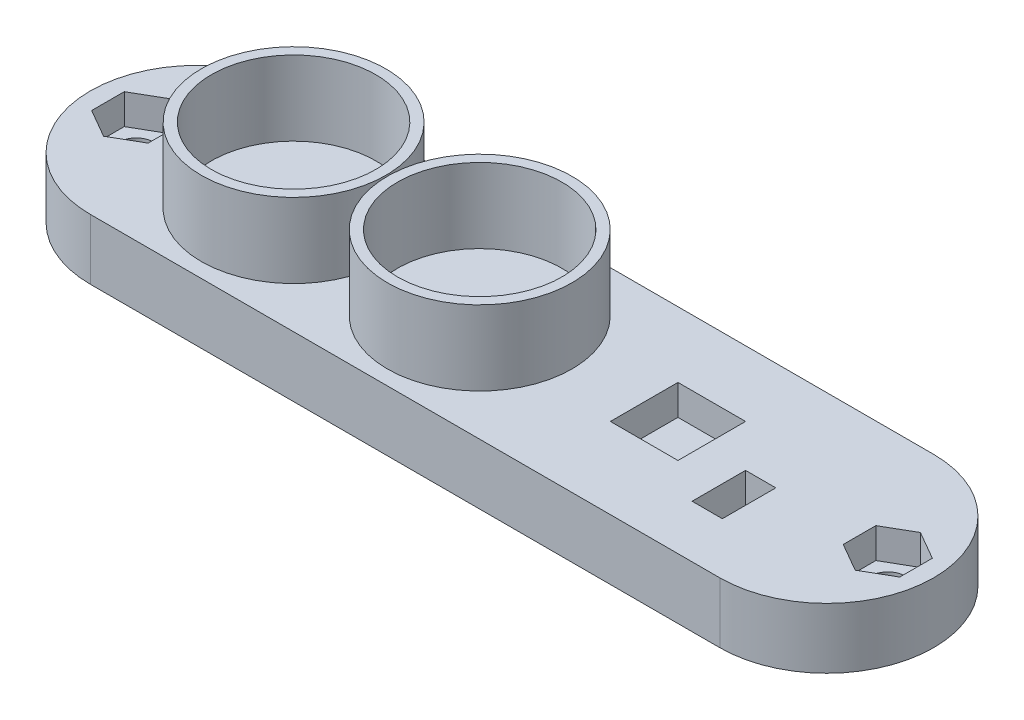
ISO-10303-21;
HEADER;
FILE_DESCRIPTION(('STEP AP214'),'2;1');
FILE_NAME('part.step','',(''),(''),'','','');
FILE_SCHEMA(('AUTOMOTIVE_DESIGN { 1 0 10303 214 1 1 1 1 }'));
ENDSEC;
DATA;
#1=APPLICATION_CONTEXT('core data for automotive mechanical design processes');
#2=APPLICATION_PROTOCOL_DEFINITION('international standard','automotive_design',2000,#1);
#3=PRODUCT_CONTEXT('',#1,'mechanical');
#4=PRODUCT('Part','Part','',(#3));
#5=PRODUCT_RELATED_PRODUCT_CATEGORY('part','',(#4));
#6=PRODUCT_DEFINITION_FORMATION('','',#4);
#7=PRODUCT_DEFINITION_CONTEXT('part definition',#1,'design');
#8=PRODUCT_DEFINITION('design','',#6,#7);
#9=PRODUCT_DEFINITION_SHAPE('','',#8);
#10=(LENGTH_UNIT() NAMED_UNIT(*) SI_UNIT(.MILLI.,.METRE.));
#11=(NAMED_UNIT(*) PLANE_ANGLE_UNIT() SI_UNIT($,.RADIAN.));
#12=(NAMED_UNIT(*) SI_UNIT($,.STERADIAN.) SOLID_ANGLE_UNIT());
#13=UNCERTAINTY_MEASURE_WITH_UNIT(LENGTH_MEASURE(1.E-05),#10,'distance_accuracy_value','');
#14=(GEOMETRIC_REPRESENTATION_CONTEXT(3) GLOBAL_UNCERTAINTY_ASSIGNED_CONTEXT((#13)) GLOBAL_UNIT_ASSIGNED_CONTEXT((#10,
#11,#12)) REPRESENTATION_CONTEXT('',''));
#15=CARTESIAN_POINT('',(0.,0.,0.));
#16=DIRECTION('',(0.,0.,1.));
#17=DIRECTION('',(1.,0.,0.));
#18=AXIS2_PLACEMENT_3D('',#15,#16,#17);
#19=CARTESIAN_POINT('',(-31.2,6.,0.));
#20=DIRECTION('',(0.,-1.,0.));
#21=DIRECTION('',(0.,0.,-1.));
#22=AXIS2_PLACEMENT_3D('',#19,#20,#21);
#23=CYLINDRICAL_SURFACE('',#22,10.6);
#24=CARTESIAN_POINT('',(-31.2,0.,0.));
#25=DIRECTION('',(0.,1.,0.));
#26=DIRECTION('',(0.,0.,1.));
#27=AXIS2_PLACEMENT_3D('',#24,#25,#26);
#28=CIRCLE('',#27,10.6);
#29=CARTESIAN_POINT('',(-31.2,0.,-10.6));
#30=VERTEX_POINT('',#29);
#31=CARTESIAN_POINT('',(-31.2,0.,10.6));
#32=VERTEX_POINT('',#31);
#33=EDGE_CURVE('E393',#30,#32,#28,.T.);
#34=ORIENTED_EDGE('',*,*,#33,.T.);
#35=DIRECTION('',(0.,-1.,0.));
#36=VECTOR('',#35,1.);
#37=CARTESIAN_POINT('',(-31.2,6.,10.6));
#38=LINE('',#37,#36);
#39=CARTESIAN_POINT('',(-31.2,6.,10.6));
#40=VERTEX_POINT('',#39);
#41=EDGE_CURVE('E422',#40,#32,#38,.T.);
#42=ORIENTED_EDGE('',*,*,#41,.F.);
#43=CARTESIAN_POINT('',(-31.2,6.,0.));
#44=DIRECTION('',(0.,1.,0.));
#45=DIRECTION('',(0.,0.,1.));
#46=AXIS2_PLACEMENT_3D('',#43,#44,#45);
#47=CIRCLE('',#46,10.6);
#48=CARTESIAN_POINT('',(-31.2,6.,-10.6));
#49=VERTEX_POINT('',#48);
#50=EDGE_CURVE('E396',#49,#40,#47,.T.);
#51=ORIENTED_EDGE('',*,*,#50,.F.);
#52=DIRECTION('',(0.,-1.,0.));
#53=VECTOR('',#52,1.);
#54=CARTESIAN_POINT('',(-31.2,6.,-10.6));
#55=LINE('',#54,#53);
#56=EDGE_CURVE('E406',#49,#30,#55,.T.);
#57=ORIENTED_EDGE('',*,*,#56,.T.);
#58=EDGE_LOOP('',(#34,#42,#51,#57));
#59=FACE_BOUND('',#58,.T.);
#60=ADVANCED_FACE('F41',(#59),#23,.T.);
#61=CARTESIAN_POINT('',(-31.2,6.,10.6));
#62=DIRECTION('',(0.,0.,-1.));
#63=DIRECTION('',(-1.,0.,0.));
#64=AXIS2_PLACEMENT_3D('',#61,#62,#63);
#65=PLANE('',#64);
#66=DIRECTION('',(1.,0.,0.));
#67=VECTOR('',#66,1.);
#68=CARTESIAN_POINT('',(-31.2,0.,10.6));
#69=LINE('',#68,#67);
#70=CARTESIAN_POINT('',(31.2,0.,10.6));
#71=VERTEX_POINT('',#70);
#72=EDGE_CURVE('E409',#32,#71,#69,.T.);
#73=ORIENTED_EDGE('',*,*,#72,.T.);
#74=DIRECTION('',(0.,-1.,0.));
#75=VECTOR('',#74,1.);
#76=CARTESIAN_POINT('',(31.2,6.,10.6));
#77=LINE('',#76,#75);
#78=CARTESIAN_POINT('',(31.2,6.,10.6));
#79=VERTEX_POINT('',#78);
#80=EDGE_CURVE('E419',#79,#71,#77,.T.);
#81=ORIENTED_EDGE('',*,*,#80,.F.);
#82=DIRECTION('',(1.,0.,0.));
#83=VECTOR('',#82,1.);
#84=CARTESIAN_POINT('',(-31.2,6.,10.6));
#85=LINE('',#84,#83);
#86=EDGE_CURVE('E399',#40,#79,#85,.T.);
#87=ORIENTED_EDGE('',*,*,#86,.F.);
#88=ORIENTED_EDGE('',*,*,#41,.T.);
#89=EDGE_LOOP('',(#73,#81,#87,#88));
#90=FACE_BOUND('',#89,.T.);
#91=ADVANCED_FACE('F456',(#90),#65,.F.);
#92=CARTESIAN_POINT('',(31.2,6.,0.));
#93=DIRECTION('',(0.,-1.,0.));
#94=DIRECTION('',(0.,0.,-1.));
#95=AXIS2_PLACEMENT_3D('',#92,#93,#94);
#96=CYLINDRICAL_SURFACE('',#95,10.6);
#97=CARTESIAN_POINT('',(31.2,0.,0.));
#98=DIRECTION('',(0.,1.,0.));
#99=DIRECTION('',(0.,0.,1.));
#100=AXIS2_PLACEMENT_3D('',#97,#98,#99);
#101=CIRCLE('',#100,10.6);
#102=CARTESIAN_POINT('',(31.2,0.,-10.6));
#103=VERTEX_POINT('',#102);
#104=EDGE_CURVE('E411',#71,#103,#101,.T.);
#105=ORIENTED_EDGE('',*,*,#104,.T.);
#106=DIRECTION('',(0.,-1.,0.));
#107=VECTOR('',#106,1.);
#108=CARTESIAN_POINT('',(31.2,6.,-10.6));
#109=LINE('',#108,#107);
#110=CARTESIAN_POINT('',(31.2,6.,-10.6));
#111=VERTEX_POINT('',#110);
#112=EDGE_CURVE('E416',#111,#103,#109,.T.);
#113=ORIENTED_EDGE('',*,*,#112,.F.);
#114=CARTESIAN_POINT('',(31.2,6.,0.));
#115=DIRECTION('',(0.,1.,0.));
#116=DIRECTION('',(0.,0.,1.));
#117=AXIS2_PLACEMENT_3D('',#114,#115,#116);
#118=CIRCLE('',#117,10.6);
#119=EDGE_CURVE('E402',#79,#111,#118,.T.);
#120=ORIENTED_EDGE('',*,*,#119,.F.);
#121=ORIENTED_EDGE('',*,*,#80,.T.);
#122=EDGE_LOOP('',(#105,#113,#120,#121));
#123=FACE_BOUND('',#122,.T.);
#124=ADVANCED_FACE('F461',(#123),#96,.T.);
#125=CARTESIAN_POINT('',(-31.2,6.,-10.6));
#126=DIRECTION('',(0.,0.,1.));
#127=DIRECTION('',(1.,0.,0.));
#128=AXIS2_PLACEMENT_3D('',#125,#126,#127);
#129=PLANE('',#128);
#130=DIRECTION('',(-1.,0.,0.));
#131=VECTOR('',#130,1.);
#132=CARTESIAN_POINT('',(-31.2,0.,-10.6));
#133=LINE('',#132,#131);
#134=EDGE_CURVE('E400',#103,#30,#133,.T.);
#135=ORIENTED_EDGE('',*,*,#134,.T.);
#136=ORIENTED_EDGE('',*,*,#56,.F.);
#137=DIRECTION('',(-1.,0.,0.));
#138=VECTOR('',#137,1.);
#139=CARTESIAN_POINT('',(-31.2,6.,-10.6));
#140=LINE('',#139,#138);
#141=EDGE_CURVE('E404',#111,#49,#140,.T.);
#142=ORIENTED_EDGE('',*,*,#141,.F.);
#143=ORIENTED_EDGE('',*,*,#112,.T.);
#144=EDGE_LOOP('',(#135,#136,#142,#143));
#145=FACE_BOUND('',#144,.T.);
#146=ADVANCED_FACE('F449',(#145),#129,.F.);
#147=CARTESIAN_POINT('',(-31.2,6.,0.));
#148=DIRECTION('',(0.,1.,0.));
#149=DIRECTION('',(0.,0.,1.));
#150=AXIS2_PLACEMENT_3D('',#147,#148,#149);
#151=PLANE('',#150);
#152=DIRECTION('',(0.,0.,1.));
#153=VECTOR('',#152,1.);
#154=CARTESIAN_POINT('',(23.25,6.,0.099999999999989));
#155=LINE('',#154,#153);
#156=CARTESIAN_POINT('',(23.25,6.,0.099999999999989));
#157=VERTEX_POINT('',#156);
#158=CARTESIAN_POINT('',(23.25,6.,5.39999999999999));
#159=VERTEX_POINT('',#158);
#160=EDGE_CURVE('E55',#157,#159,#155,.T.);
#161=ORIENTED_EDGE('',*,*,#160,.F.);
#162=DIRECTION('',(-1.,0.,0.));
#163=VECTOR('',#162,1.);
#164=CARTESIAN_POINT('',(23.25,6.,0.099999999999989));
#165=LINE('',#164,#163);
#166=CARTESIAN_POINT('',(26.25,6.,0.099999999999989));
#167=VERTEX_POINT('',#166);
#168=EDGE_CURVE('E221',#167,#157,#165,.T.);
#169=ORIENTED_EDGE('',*,*,#168,.F.);
#170=DIRECTION('',(0.,0.,-1.));
#171=VECTOR('',#170,1.);
#172=CARTESIAN_POINT('',(26.25,6.,0.099999999999989));
#173=LINE('',#172,#171);
#174=CARTESIAN_POINT('',(26.25,6.,5.39999999999999));
#175=VERTEX_POINT('',#174);
#176=EDGE_CURVE('E224',#175,#167,#173,.T.);
#177=ORIENTED_EDGE('',*,*,#176,.F.);
#178=DIRECTION('',(1.,0.,0.));
#179=VECTOR('',#178,1.);
#180=CARTESIAN_POINT('',(23.25,6.,5.39999999999999));
#181=LINE('',#180,#179);
#182=EDGE_CURVE('E230',#159,#175,#181,.T.);
#183=ORIENTED_EDGE('',*,*,#182,.F.);
#184=EDGE_LOOP('',(#161,#169,#177,#183));
#185=FACE_BOUND('',#184,.T.);
#186=DIRECTION('',(0.,0.,1.));
#187=VECTOR('',#186,1.);
#188=CARTESIAN_POINT('',(12.35,6.,-4.10000000000001));
#189=LINE('',#188,#187);
#190=CARTESIAN_POINT('',(12.35,6.,-4.10000000000001));
#191=VERTEX_POINT('',#190);
#192=CARTESIAN_POINT('',(12.35,6.,2.59999999999999));
#193=VERTEX_POINT('',#192);
#194=EDGE_CURVE('E63',#191,#193,#189,.T.);
#195=ORIENTED_EDGE('',*,*,#194,.F.);
#196=DIRECTION('',(-1.,0.,0.));
#197=VECTOR('',#196,1.);
#198=CARTESIAN_POINT('',(12.35,6.,-4.10000000000001));
#199=LINE('',#198,#197);
#200=CARTESIAN_POINT('',(19.05,6.,-4.10000000000001));
#201=VERTEX_POINT('',#200);
#202=EDGE_CURVE('E249',#201,#191,#199,.T.);
#203=ORIENTED_EDGE('',*,*,#202,.F.);
#204=DIRECTION('',(0.,0.,-1.));
#205=VECTOR('',#204,1.);
#206=CARTESIAN_POINT('',(19.05,6.,-4.10000000000001));
#207=LINE('',#206,#205);
#208=CARTESIAN_POINT('',(19.05,6.,2.59999999999999));
#209=VERTEX_POINT('',#208);
#210=EDGE_CURVE('E252',#209,#201,#207,.T.);
#211=ORIENTED_EDGE('',*,*,#210,.F.);
#212=DIRECTION('',(1.,0.,0.));
#213=VECTOR('',#212,1.);
#214=CARTESIAN_POINT('',(12.35,6.,2.59999999999999));
#215=LINE('',#214,#213);
#216=EDGE_CURVE('E256',#193,#209,#215,.T.);
#217=ORIENTED_EDGE('',*,*,#216,.F.);
#218=EDGE_LOOP('',(#195,#203,#211,#217));
#219=FACE_BOUND('',#218,.T.);
#220=DIRECTION('',(0.86602540378444,0.,0.499999999999997));
#221=VECTOR('',#220,1.);
#222=CARTESIAN_POINT('',(-40.05,6.,1.61658075373096));
#223=LINE('',#222,#221);
#224=CARTESIAN_POINT('',(-40.05,6.,1.61658075373096));
#225=VERTEX_POINT('',#224);
#226=CARTESIAN_POINT('',(-37.25,6.,3.2331615074619));
#227=VERTEX_POINT('',#226);
#228=EDGE_CURVE('E302',#225,#227,#223,.T.);
#229=ORIENTED_EDGE('',*,*,#228,.F.);
#230=DIRECTION('',(0.,0.,1.));
#231=VECTOR('',#230,1.);
#232=CARTESIAN_POINT('',(-40.05,6.,-1.61658075373095));
#233=LINE('',#232,#231);
#234=CARTESIAN_POINT('',(-40.05,6.,-1.61658075373095));
#235=VERTEX_POINT('',#234);
#236=EDGE_CURVE('E286',#235,#225,#233,.T.);
#237=ORIENTED_EDGE('',*,*,#236,.F.);
#238=DIRECTION('',(-0.866025403784438,0.,0.500000000000001));
#239=VECTOR('',#238,1.);
#240=CARTESIAN_POINT('',(-37.25,6.,-3.2331615074619));
#241=LINE('',#240,#239);
#242=CARTESIAN_POINT('',(-37.25,6.,-3.2331615074619));
#243=VERTEX_POINT('',#242);
#244=EDGE_CURVE('E314',#243,#235,#241,.T.);
#245=ORIENTED_EDGE('',*,*,#244,.F.);
#246=DIRECTION('',(-0.86602540378444,0.,-0.499999999999997));
#247=VECTOR('',#246,1.);
#248=CARTESIAN_POINT('',(-34.45,6.,-1.61658075373096));
#249=LINE('',#248,#247);
#250=CARTESIAN_POINT('',(-34.45,6.,-1.61658075373096));
#251=VERTEX_POINT('',#250);
#252=EDGE_CURVE('E311',#251,#243,#249,.T.);
#253=ORIENTED_EDGE('',*,*,#252,.F.);
#254=DIRECTION('',(0.,0.,-1.));
#255=VECTOR('',#254,1.);
#256=CARTESIAN_POINT('',(-34.45,6.,1.61658075373095));
#257=LINE('',#256,#255);
#258=CARTESIAN_POINT('',(-34.45,6.,1.61658075373095));
#259=VERTEX_POINT('',#258);
#260=EDGE_CURVE('E308',#259,#251,#257,.T.);
#261=ORIENTED_EDGE('',*,*,#260,.F.);
#262=DIRECTION('',(0.866025403784439,0.,-0.5));
#263=VECTOR('',#262,1.);
#264=CARTESIAN_POINT('',(-37.25,6.,3.2331615074619));
#265=LINE('',#264,#263);
#266=EDGE_CURVE('E304',#227,#259,#265,.T.);
#267=ORIENTED_EDGE('',*,*,#266,.F.);
#268=EDGE_LOOP('',(#229,#237,#245,#253,#261,#267));
#269=FACE_BOUND('',#268,.T.);
#270=DIRECTION('',(0.866025403784437,0.,0.500000000000002));
#271=VECTOR('',#270,1.);
#272=CARTESIAN_POINT('',(34.45,6.,1.61658075373095));
#273=LINE('',#272,#271);
#274=CARTESIAN_POINT('',(34.45,6.,1.61658075373095));
#275=VERTEX_POINT('',#274);
#276=CARTESIAN_POINT('',(37.25,6.,3.2331615074619));
#277=VERTEX_POINT('',#276);
#278=EDGE_CURVE('E305',#275,#277,#273,.T.);
#279=ORIENTED_EDGE('',*,*,#278,.F.);
#280=DIRECTION('',(0.,0.,1.));
#281=VECTOR('',#280,1.);
#282=CARTESIAN_POINT('',(34.45,6.,-1.61658075373095));
#283=LINE('',#282,#281);
#284=CARTESIAN_POINT('',(34.45,6.,-1.61658075373095));
#285=VERTEX_POINT('',#284);
#286=EDGE_CURVE('E345',#285,#275,#283,.T.);
#287=ORIENTED_EDGE('',*,*,#286,.F.);
#288=DIRECTION('',(-0.866025403784438,0.,0.5));
#289=VECTOR('',#288,1.);
#290=CARTESIAN_POINT('',(37.25,6.,-3.23316150746191));
#291=LINE('',#290,#289);
#292=CARTESIAN_POINT('',(37.25,6.,-3.23316150746191));
#293=VERTEX_POINT('',#292);
#294=EDGE_CURVE('E348',#293,#285,#291,.T.);
#295=ORIENTED_EDGE('',*,*,#294,.F.);
#296=DIRECTION('',(-0.866025403784438,0.,-0.500000000000001));
#297=VECTOR('',#296,1.);
#298=CARTESIAN_POINT('',(40.05,6.,-1.61658075373095));
#299=LINE('',#298,#297);
#300=CARTESIAN_POINT('',(40.05,6.,-1.61658075373095));
#301=VERTEX_POINT('',#300);
#302=EDGE_CURVE('E352',#301,#293,#299,.T.);
#303=ORIENTED_EDGE('',*,*,#302,.F.);
#304=DIRECTION('',(0.,0.,-1.));
#305=VECTOR('',#304,1.);
#306=CARTESIAN_POINT('',(40.05,6.,1.61658075373095));
#307=LINE('',#306,#305);
#308=CARTESIAN_POINT('',(40.05,6.,1.61658075373095));
#309=VERTEX_POINT('',#308);
#310=EDGE_CURVE('E355',#309,#301,#307,.T.);
#311=ORIENTED_EDGE('',*,*,#310,.F.);
#312=DIRECTION('',(0.866025403784441,0.,-0.499999999999996));
#313=VECTOR('',#312,1.);
#314=CARTESIAN_POINT('',(37.25,6.,3.2331615074619));
#315=LINE('',#314,#313);
#316=EDGE_CURVE('E358',#277,#309,#315,.T.);
#317=ORIENTED_EDGE('',*,*,#316,.F.);
#318=EDGE_LOOP('',(#279,#287,#295,#303,#311,#317));
#319=FACE_BOUND('',#318,.T.);
#320=CARTESIAN_POINT('',(-3.2,6.,0.));
#321=DIRECTION('',(0.,1.,0.));
#322=DIRECTION('',(0.,0.,1.));
#323=AXIS2_PLACEMENT_3D('',#320,#321,#322);
#324=CIRCLE('',#323,9.15);
#325=CARTESIAN_POINT('',(-3.2,6.,9.15));
#326=VERTEX_POINT('',#325);
#327=EDGE_CURVE('E378',#326,#326,#324,.T.);
#328=ORIENTED_EDGE('',*,*,#327,.F.);
#329=EDGE_LOOP('',(#328));
#330=FACE_BOUND('',#329,.T.);
#331=CARTESIAN_POINT('',(-21.65,6.,0.));
#332=DIRECTION('',(0.,1.,0.));
#333=DIRECTION('',(0.,0.,1.));
#334=AXIS2_PLACEMENT_3D('',#331,#332,#333);
#335=CIRCLE('',#334,9.15);
#336=CARTESIAN_POINT('',(-21.65,6.,9.15));
#337=VERTEX_POINT('',#336);
#338=EDGE_CURVE('E389',#337,#337,#335,.T.);
#339=ORIENTED_EDGE('',*,*,#338,.F.);
#340=EDGE_LOOP('',(#339));
#341=FACE_BOUND('',#340,.T.);
#342=ORIENTED_EDGE('',*,*,#50,.T.);
#343=ORIENTED_EDGE('',*,*,#86,.T.);
#344=ORIENTED_EDGE('',*,*,#119,.T.);
#345=ORIENTED_EDGE('',*,*,#141,.T.);
#346=EDGE_LOOP('',(#342,#343,#344,#345));
#347=FACE_BOUND('',#346,.T.);
#348=ADVANCED_FACE('F433',(#185,#219,#269,#319,#330,#341,#347),#151,.T.);
#349=CARTESIAN_POINT('',(-31.2,0.,0.));
#350=DIRECTION('',(0.,1.,0.));
#351=DIRECTION('',(0.,0.,1.));
#352=AXIS2_PLACEMENT_3D('',#349,#350,#351);
#353=PLANE('',#352);
#354=CARTESIAN_POINT('',(-37.25,0.,0.));
#355=DIRECTION('',(0.,1.,0.));
#356=DIRECTION('',(0.,0.,1.));
#357=AXIS2_PLACEMENT_3D('',#354,#355,#356);
#358=CIRCLE('',#357,1.75);
#359=CARTESIAN_POINT('',(-37.25,0.,1.75));
#360=VERTEX_POINT('',#359);
#361=EDGE_CURVE('E270',#360,#360,#358,.T.);
#362=ORIENTED_EDGE('',*,*,#361,.T.);
#363=EDGE_LOOP('',(#362));
#364=FACE_BOUND('',#363,.T.);
#365=CARTESIAN_POINT('',(37.25,0.,0.));
#366=DIRECTION('',(0.,1.,0.));
#367=DIRECTION('',(0.,0.,1.));
#368=AXIS2_PLACEMENT_3D('',#365,#366,#367);
#369=CIRCLE('',#368,1.75);
#370=CARTESIAN_POINT('',(37.25,0.,1.75));
#371=VERTEX_POINT('',#370);
#372=EDGE_CURVE('E236',#371,#371,#369,.T.);
#373=ORIENTED_EDGE('',*,*,#372,.T.);
#374=EDGE_LOOP('',(#373));
#375=FACE_BOUND('',#374,.T.);
#376=ORIENTED_EDGE('',*,*,#33,.F.);
#377=ORIENTED_EDGE('',*,*,#134,.F.);
#378=ORIENTED_EDGE('',*,*,#104,.F.);
#379=ORIENTED_EDGE('',*,*,#72,.F.);
#380=EDGE_LOOP('',(#376,#377,#378,#379));
#381=FACE_BOUND('',#380,.T.);
#382=ADVANCED_FACE('F448',(#364,#375,#381),#353,.F.);
#383=CARTESIAN_POINT('',(-21.65,13.4,0.));
#384=DIRECTION('',(0.,1.,0.));
#385=DIRECTION('',(0.,0.,1.));
#386=AXIS2_PLACEMENT_3D('',#383,#384,#385);
#387=PLANE('',#386);
#388=CARTESIAN_POINT('',(-21.65,13.4,0.));
#389=DIRECTION('',(0.,1.,0.));
#390=DIRECTION('',(0.,0.,1.));
#391=AXIS2_PLACEMENT_3D('',#388,#389,#390);
#392=CIRCLE('',#391,9.15);
#393=CARTESIAN_POINT('',(-21.65,13.4,9.15));
#394=VERTEX_POINT('',#393);
#395=EDGE_CURVE('E390',#394,#394,#392,.T.);
#396=ORIENTED_EDGE('',*,*,#395,.T.);
#397=EDGE_LOOP('',(#396));
#398=FACE_BOUND('',#397,.T.);
#399=CARTESIAN_POINT('',(-21.65,13.4,0.));
#400=DIRECTION('',(0.,1.,0.));
#401=DIRECTION('',(0.,0.,1.));
#402=AXIS2_PLACEMENT_3D('',#399,#400,#401);
#403=CIRCLE('',#402,8.15);
#404=CARTESIAN_POINT('',(-21.65,13.4,8.15));
#405=VERTEX_POINT('',#404);
#406=EDGE_CURVE('E386',#405,#405,#403,.T.);
#407=ORIENTED_EDGE('',*,*,#406,.F.);
#408=EDGE_LOOP('',(#407));
#409=FACE_BOUND('',#408,.T.);
#410=ADVANCED_FACE('F484',(#398,#409),#387,.T.);
#411=CARTESIAN_POINT('',(-21.65,13.4,0.));
#412=DIRECTION('',(0.,-1.,0.));
#413=DIRECTION('',(0.,0.,-1.));
#414=AXIS2_PLACEMENT_3D('',#411,#412,#413);
#415=CYLINDRICAL_SURFACE('',#414,9.15);
#416=ORIENTED_EDGE('',*,*,#395,.F.);
#417=EDGE_LOOP('',(#416));
#418=FACE_BOUND('',#417,.T.);
#419=ORIENTED_EDGE('',*,*,#338,.T.);
#420=EDGE_LOOP('',(#419));
#421=FACE_BOUND('',#420,.T.);
#422=ADVANCED_FACE('F442',(#418,#421),#415,.T.);
#423=CARTESIAN_POINT('',(-21.65,13.4,0.));
#424=DIRECTION('',(0.,-1.,0.));
#425=DIRECTION('',(0.,0.,-1.));
#426=AXIS2_PLACEMENT_3D('',#423,#424,#425);
#427=CYLINDRICAL_SURFACE('',#426,8.15);
#428=ORIENTED_EDGE('',*,*,#406,.T.);
#429=EDGE_LOOP('',(#428));
#430=FACE_BOUND('',#429,.T.);
#431=CARTESIAN_POINT('',(-21.65,6.,0.));
#432=DIRECTION('',(0.,1.,0.));
#433=DIRECTION('',(0.,0.,1.));
#434=AXIS2_PLACEMENT_3D('',#431,#432,#433);
#435=CIRCLE('',#434,8.15);
#436=CARTESIAN_POINT('',(-21.65,6.,8.15));
#437=VERTEX_POINT('',#436);
#438=EDGE_CURVE('E48',#437,#437,#435,.F.);
#439=ORIENTED_EDGE('',*,*,#438,.T.);
#440=EDGE_LOOP('',(#439));
#441=FACE_BOUND('',#440,.T.);
#442=ADVANCED_FACE('F427',(#430,#441),#427,.F.);
#443=ORIENTED_EDGE('',*,*,#438,.F.);
#444=EDGE_LOOP('',(#443));
#445=FACE_BOUND('',#444,.T.);
#446=ADVANCED_FACE('F429',(#445),#151,.T.);
#447=CARTESIAN_POINT('',(-3.2,13.4,0.));
#448=DIRECTION('',(0.,1.,0.));
#449=DIRECTION('',(0.,0.,1.));
#450=AXIS2_PLACEMENT_3D('',#447,#448,#449);
#451=PLANE('',#450);
#452=CARTESIAN_POINT('',(-3.2,13.4,0.));
#453=DIRECTION('',(0.,1.,0.));
#454=DIRECTION('',(0.,0.,1.));
#455=AXIS2_PLACEMENT_3D('',#452,#453,#454);
#456=CIRCLE('',#455,9.15);
#457=CARTESIAN_POINT('',(-3.2,13.4,9.15));
#458=VERTEX_POINT('',#457);
#459=EDGE_CURVE('E321',#458,#458,#456,.T.);
#460=ORIENTED_EDGE('',*,*,#459,.T.);
#461=EDGE_LOOP('',(#460));
#462=FACE_BOUND('',#461,.T.);
#463=CARTESIAN_POINT('',(-3.2,13.4,0.));
#464=DIRECTION('',(0.,1.,0.));
#465=DIRECTION('',(0.,0.,1.));
#466=AXIS2_PLACEMENT_3D('',#463,#464,#465);
#467=CIRCLE('',#466,8.15);
#468=CARTESIAN_POINT('',(-3.2,13.4,8.15));
#469=VERTEX_POINT('',#468);
#470=EDGE_CURVE('E381',#469,#469,#467,.T.);
#471=ORIENTED_EDGE('',*,*,#470,.F.);
#472=EDGE_LOOP('',(#471));
#473=FACE_BOUND('',#472,.T.);
#474=ADVANCED_FACE('F431',(#462,#473),#451,.T.);
#475=CARTESIAN_POINT('',(-3.2,13.4,0.));
#476=DIRECTION('',(0.,-1.,0.));
#477=DIRECTION('',(0.,0.,-1.));
#478=AXIS2_PLACEMENT_3D('',#475,#476,#477);
#479=CYLINDRICAL_SURFACE('',#478,9.15);
#480=ORIENTED_EDGE('',*,*,#459,.F.);
#481=EDGE_LOOP('',(#480));
#482=FACE_BOUND('',#481,.T.);
#483=ORIENTED_EDGE('',*,*,#327,.T.);
#484=EDGE_LOOP('',(#483));
#485=FACE_BOUND('',#484,.T.);
#486=ADVANCED_FACE('F439',(#482,#485),#479,.T.);
#487=CARTESIAN_POINT('',(-3.2,13.4,0.));
#488=DIRECTION('',(0.,-1.,0.));
#489=DIRECTION('',(0.,0.,-1.));
#490=AXIS2_PLACEMENT_3D('',#487,#488,#489);
#491=CYLINDRICAL_SURFACE('',#490,8.15);
#492=ORIENTED_EDGE('',*,*,#470,.T.);
#493=EDGE_LOOP('',(#492));
#494=FACE_BOUND('',#493,.T.);
#495=CARTESIAN_POINT('',(-3.2,6.,0.));
#496=DIRECTION('',(0.,1.,0.));
#497=DIRECTION('',(0.,0.,1.));
#498=AXIS2_PLACEMENT_3D('',#495,#496,#497);
#499=CIRCLE('',#498,8.15);
#500=CARTESIAN_POINT('',(-3.2,6.,8.15));
#501=VERTEX_POINT('',#500);
#502=EDGE_CURVE('E11',#501,#501,#499,.F.);
#503=ORIENTED_EDGE('',*,*,#502,.T.);
#504=EDGE_LOOP('',(#503));
#505=FACE_BOUND('',#504,.T.);
#506=ADVANCED_FACE('F453',(#494,#505),#491,.F.);
#507=ORIENTED_EDGE('',*,*,#502,.F.);
#508=EDGE_LOOP('',(#507));
#509=FACE_BOUND('',#508,.T.);
#510=ADVANCED_FACE('F434',(#509),#151,.T.);
#511=CARTESIAN_POINT('',(34.45,3.,1.61658075373095));
#512=DIRECTION('',(-0.500000000000002,0.,0.866025403784437));
#513=DIRECTION('',(0.866025403784438,0.,0.500000000000002));
#514=AXIS2_PLACEMENT_3D('',#511,#512,#513);
#515=PLANE('',#514);
#516=ORIENTED_EDGE('',*,*,#278,.T.);
#517=DIRECTION('',(0.,1.,0.));
#518=VECTOR('',#517,1.);
#519=CARTESIAN_POINT('',(37.25,3.,3.2331615074619));
#520=LINE('',#519,#518);
#521=CARTESIAN_POINT('',(37.25,3.,3.2331615074619));
#522=VERTEX_POINT('',#521);
#523=EDGE_CURVE('E332',#522,#277,#520,.T.);
#524=ORIENTED_EDGE('',*,*,#523,.F.);
#525=DIRECTION('',(0.866025403784437,0.,0.500000000000002));
#526=VECTOR('',#525,1.);
#527=CARTESIAN_POINT('',(34.45,3.,1.61658075373095));
#528=LINE('',#527,#526);
#529=CARTESIAN_POINT('',(34.45,3.,1.61658075373095));
#530=VERTEX_POINT('',#529);
#531=EDGE_CURVE('E349',#530,#522,#528,.T.);
#532=ORIENTED_EDGE('',*,*,#531,.F.);
#533=DIRECTION('',(0.,1.,0.));
#534=VECTOR('',#533,1.);
#535=CARTESIAN_POINT('',(34.45,3.,1.61658075373095));
#536=LINE('',#535,#534);
#537=EDGE_CURVE('E273',#530,#275,#536,.T.);
#538=ORIENTED_EDGE('',*,*,#537,.T.);
#539=EDGE_LOOP('',(#516,#524,#532,#538));
#540=FACE_BOUND('',#539,.T.);
#541=ADVANCED_FACE('F452',(#540),#515,.F.);
#542=CARTESIAN_POINT('',(34.45,3.,-1.61658075373095));
#543=DIRECTION('',(-1.,0.,0.));
#544=DIRECTION('',(0.,0.,1.));
#545=AXIS2_PLACEMENT_3D('',#542,#543,#544);
#546=PLANE('',#545);
#547=ORIENTED_EDGE('',*,*,#286,.T.);
#548=ORIENTED_EDGE('',*,*,#537,.F.);
#549=DIRECTION('',(0.,0.,1.));
#550=VECTOR('',#549,1.);
#551=CARTESIAN_POINT('',(34.45,3.,-1.61658075373095));
#552=LINE('',#551,#550);
#553=CARTESIAN_POINT('',(34.45,3.,-1.61658075373095));
#554=VERTEX_POINT('',#553);
#555=EDGE_CURVE('E335',#554,#530,#552,.T.);
#556=ORIENTED_EDGE('',*,*,#555,.F.);
#557=DIRECTION('',(0.,1.,0.));
#558=VECTOR('',#557,1.);
#559=CARTESIAN_POINT('',(34.45,3.,-1.61658075373095));
#560=LINE('',#559,#558);
#561=EDGE_CURVE('E342',#554,#285,#560,.T.);
#562=ORIENTED_EDGE('',*,*,#561,.T.);
#563=EDGE_LOOP('',(#547,#548,#556,#562));
#564=FACE_BOUND('',#563,.T.);
#565=ADVANCED_FACE('F531',(#564),#546,.F.);
#566=CARTESIAN_POINT('',(37.25,3.,-3.23316150746191));
#567=DIRECTION('',(-0.5,0.,-0.866025403784438));
#568=DIRECTION('',(-0.866025403784438,0.,0.5));
#569=AXIS2_PLACEMENT_3D('',#566,#567,#568);
#570=PLANE('',#569);
#571=ORIENTED_EDGE('',*,*,#294,.T.);
#572=ORIENTED_EDGE('',*,*,#561,.F.);
#573=DIRECTION('',(-0.866025403784438,0.,0.5));
#574=VECTOR('',#573,1.);
#575=CARTESIAN_POINT('',(37.25,3.,-3.23316150746191));
#576=LINE('',#575,#574);
#577=CARTESIAN_POINT('',(37.25,3.,-3.23316150746191));
#578=VERTEX_POINT('',#577);
#579=EDGE_CURVE('E364',#578,#554,#576,.T.);
#580=ORIENTED_EDGE('',*,*,#579,.F.);
#581=DIRECTION('',(0.,1.,0.));
#582=VECTOR('',#581,1.);
#583=CARTESIAN_POINT('',(37.25,3.,-3.23316150746191));
#584=LINE('',#583,#582);
#585=EDGE_CURVE('E340',#578,#293,#584,.T.);
#586=ORIENTED_EDGE('',*,*,#585,.T.);
#587=EDGE_LOOP('',(#571,#572,#580,#586));
#588=FACE_BOUND('',#587,.T.);
#589=ADVANCED_FACE('F528',(#588),#570,.F.);
#590=CARTESIAN_POINT('',(40.05,3.,-1.61658075373095));
#591=DIRECTION('',(0.500000000000001,0.,-0.866025403784438));
#592=DIRECTION('',(-0.866025403784438,0.,-0.500000000000001));
#593=AXIS2_PLACEMENT_3D('',#590,#591,#592);
#594=PLANE('',#593);
#595=ORIENTED_EDGE('',*,*,#302,.T.);
#596=ORIENTED_EDGE('',*,*,#585,.F.);
#597=DIRECTION('',(-0.866025403784438,0.,-0.500000000000001));
#598=VECTOR('',#597,1.);
#599=CARTESIAN_POINT('',(40.05,3.,-1.61658075373095));
#600=LINE('',#599,#598);
#601=CARTESIAN_POINT('',(40.05,3.,-1.61658075373095));
#602=VERTEX_POINT('',#601);
#603=EDGE_CURVE('E367',#602,#578,#600,.T.);
#604=ORIENTED_EDGE('',*,*,#603,.F.);
#605=DIRECTION('',(0.,1.,0.));
#606=VECTOR('',#605,1.);
#607=CARTESIAN_POINT('',(40.05,3.,-1.61658075373095));
#608=LINE('',#607,#606);
#609=EDGE_CURVE('E338',#602,#301,#608,.T.);
#610=ORIENTED_EDGE('',*,*,#609,.T.);
#611=EDGE_LOOP('',(#595,#596,#604,#610));
#612=FACE_BOUND('',#611,.T.);
#613=ADVANCED_FACE('F524',(#612),#594,.F.);
#614=CARTESIAN_POINT('',(40.05,3.,1.61658075373095));
#615=DIRECTION('',(1.,0.,0.));
#616=DIRECTION('',(0.,0.,-1.));
#617=AXIS2_PLACEMENT_3D('',#614,#615,#616);
#618=PLANE('',#617);
#619=ORIENTED_EDGE('',*,*,#310,.T.);
#620=ORIENTED_EDGE('',*,*,#609,.F.);
#621=DIRECTION('',(0.,0.,-1.));
#622=VECTOR('',#621,1.);
#623=CARTESIAN_POINT('',(40.05,3.,1.61658075373095));
#624=LINE('',#623,#622);
#625=CARTESIAN_POINT('',(40.05,3.,1.61658075373095));
#626=VERTEX_POINT('',#625);
#627=EDGE_CURVE('E370',#626,#602,#624,.T.);
#628=ORIENTED_EDGE('',*,*,#627,.F.);
#629=DIRECTION('',(0.,1.,0.));
#630=VECTOR('',#629,1.);
#631=CARTESIAN_POINT('',(40.05,3.,1.61658075373095));
#632=LINE('',#631,#630);
#633=EDGE_CURVE('E336',#626,#309,#632,.T.);
#634=ORIENTED_EDGE('',*,*,#633,.T.);
#635=EDGE_LOOP('',(#619,#620,#628,#634));
#636=FACE_BOUND('',#635,.T.);
#637=ADVANCED_FACE('F520',(#636),#618,.F.);
#638=CARTESIAN_POINT('',(37.25,3.,3.2331615074619));
#639=DIRECTION('',(0.499999999999996,0.,0.866025403784441));
#640=DIRECTION('',(0.866025403784441,0.,-0.499999999999996));
#641=AXIS2_PLACEMENT_3D('',#638,#639,#640);
#642=PLANE('',#641);
#643=ORIENTED_EDGE('',*,*,#316,.T.);
#644=ORIENTED_EDGE('',*,*,#633,.F.);
#645=DIRECTION('',(0.866025403784441,0.,-0.499999999999996));
#646=VECTOR('',#645,1.);
#647=CARTESIAN_POINT('',(37.25,3.,3.2331615074619));
#648=LINE('',#647,#646);
#649=EDGE_CURVE('E373',#522,#626,#648,.T.);
#650=ORIENTED_EDGE('',*,*,#649,.F.);
#651=ORIENTED_EDGE('',*,*,#523,.T.);
#652=EDGE_LOOP('',(#643,#644,#650,#651));
#653=FACE_BOUND('',#652,.T.);
#654=ADVANCED_FACE('F508',(#653),#642,.F.);
#655=CARTESIAN_POINT('',(0.,3.,0.));
#656=DIRECTION('',(0.,1.,0.));
#657=DIRECTION('',(0.,0.,1.));
#658=AXIS2_PLACEMENT_3D('',#655,#656,#657);
#659=PLANE('',#658);
#660=CARTESIAN_POINT('',(37.25,3.,0.));
#661=DIRECTION('',(0.,1.,0.));
#662=DIRECTION('',(0.,0.,1.));
#663=AXIS2_PLACEMENT_3D('',#660,#661,#662);
#664=CIRCLE('',#663,1.75);
#665=CARTESIAN_POINT('',(37.25,3.,1.75));
#666=VERTEX_POINT('',#665);
#667=EDGE_CURVE('E277',#666,#666,#664,.T.);
#668=ORIENTED_EDGE('',*,*,#667,.F.);
#669=EDGE_LOOP('',(#668));
#670=FACE_BOUND('',#669,.T.);
#671=ORIENTED_EDGE('',*,*,#531,.T.);
#672=ORIENTED_EDGE('',*,*,#649,.T.);
#673=ORIENTED_EDGE('',*,*,#627,.T.);
#674=ORIENTED_EDGE('',*,*,#603,.T.);
#675=ORIENTED_EDGE('',*,*,#579,.T.);
#676=ORIENTED_EDGE('',*,*,#555,.T.);
#677=EDGE_LOOP('',(#671,#672,#673,#674,#675,#676));
#678=FACE_BOUND('',#677,.T.);
#679=ADVANCED_FACE('F505',(#670,#678),#659,.T.);
#680=CARTESIAN_POINT('',(-40.05,3.,1.61658075373096));
#681=DIRECTION('',(-0.499999999999997,0.,0.86602540378444));
#682=DIRECTION('',(0.86602540378444,0.,0.499999999999997));
#683=AXIS2_PLACEMENT_3D('',#680,#681,#682);
#684=PLANE('',#683);
#685=ORIENTED_EDGE('',*,*,#228,.T.);
#686=DIRECTION('',(0.,1.,0.));
#687=VECTOR('',#686,1.);
#688=CARTESIAN_POINT('',(-37.25,3.,3.2331615074619));
#689=LINE('',#688,#687);
#690=CARTESIAN_POINT('',(-37.25,3.,3.2331615074619));
#691=VERTEX_POINT('',#690);
#692=EDGE_CURVE('E301',#691,#227,#689,.T.);
#693=ORIENTED_EDGE('',*,*,#692,.F.);
#694=DIRECTION('',(0.86602540378444,0.,0.499999999999997));
#695=VECTOR('',#694,1.);
#696=CARTESIAN_POINT('',(-40.05,3.,1.61658075373096));
#697=LINE('',#696,#695);
#698=CARTESIAN_POINT('',(-40.05,3.,1.61658075373096));
#699=VERTEX_POINT('',#698);
#700=EDGE_CURVE('E282',#699,#691,#697,.T.);
#701=ORIENTED_EDGE('',*,*,#700,.F.);
#702=DIRECTION('',(0.,1.,0.));
#703=VECTOR('',#702,1.);
#704=CARTESIAN_POINT('',(-40.05,3.,1.61658075373096));
#705=LINE('',#704,#703);
#706=EDGE_CURVE('E319',#699,#225,#705,.T.);
#707=ORIENTED_EDGE('',*,*,#706,.T.);
#708=EDGE_LOOP('',(#685,#693,#701,#707));
#709=FACE_BOUND('',#708,.T.);
#710=ADVANCED_FACE('F507',(#709),#684,.F.);
#711=CARTESIAN_POINT('',(-40.05,3.,-1.61658075373095));
#712=DIRECTION('',(-1.,0.,0.));
#713=DIRECTION('',(0.,0.,1.));
#714=AXIS2_PLACEMENT_3D('',#711,#712,#713);
#715=PLANE('',#714);
#716=ORIENTED_EDGE('',*,*,#236,.T.);
#717=ORIENTED_EDGE('',*,*,#706,.F.);
#718=DIRECTION('',(0.,0.,1.));
#719=VECTOR('',#718,1.);
#720=CARTESIAN_POINT('',(-40.05,3.,-1.61658075373095));
#721=LINE('',#720,#719);
#722=CARTESIAN_POINT('',(-40.05,3.,-1.61658075373095));
#723=VERTEX_POINT('',#722);
#724=EDGE_CURVE('E298',#723,#699,#721,.T.);
#725=ORIENTED_EDGE('',*,*,#724,.F.);
#726=DIRECTION('',(0.,1.,0.));
#727=VECTOR('',#726,1.);
#728=CARTESIAN_POINT('',(-40.05,3.,-1.61658075373095));
#729=LINE('',#728,#727);
#730=EDGE_CURVE('E322',#723,#235,#729,.T.);
#731=ORIENTED_EDGE('',*,*,#730,.T.);
#732=EDGE_LOOP('',(#716,#717,#725,#731));
#733=FACE_BOUND('',#732,.T.);
#734=ADVANCED_FACE('F564',(#733),#715,.F.);
#735=CARTESIAN_POINT('',(-37.25,3.,-3.2331615074619));
#736=DIRECTION('',(-0.500000000000001,0.,-0.866025403784438));
#737=DIRECTION('',(-0.866025403784438,0.,0.500000000000001));
#738=AXIS2_PLACEMENT_3D('',#735,#736,#737);
#739=PLANE('',#738);
#740=ORIENTED_EDGE('',*,*,#244,.T.);
#741=ORIENTED_EDGE('',*,*,#730,.F.);
#742=DIRECTION('',(-0.866025403784438,0.,0.500000000000001));
#743=VECTOR('',#742,1.);
#744=CARTESIAN_POINT('',(-37.25,3.,-3.2331615074619));
#745=LINE('',#744,#743);
#746=CARTESIAN_POINT('',(-37.25,3.,-3.2331615074619));
#747=VERTEX_POINT('',#746);
#748=EDGE_CURVE('E295',#747,#723,#745,.T.);
#749=ORIENTED_EDGE('',*,*,#748,.F.);
#750=DIRECTION('',(0.,1.,0.));
#751=VECTOR('',#750,1.);
#752=CARTESIAN_POINT('',(-37.25,3.,-3.2331615074619));
#753=LINE('',#752,#751);
#754=EDGE_CURVE('E324',#747,#243,#753,.T.);
#755=ORIENTED_EDGE('',*,*,#754,.T.);
#756=EDGE_LOOP('',(#740,#741,#749,#755));
#757=FACE_BOUND('',#756,.T.);
#758=ADVANCED_FACE('F576',(#757),#739,.F.);
#759=CARTESIAN_POINT('',(-34.45,3.,-1.61658075373096));
#760=DIRECTION('',(0.499999999999997,0.,-0.86602540378444));
#761=DIRECTION('',(-0.86602540378444,0.,-0.499999999999997));
#762=AXIS2_PLACEMENT_3D('',#759,#760,#761);
#763=PLANE('',#762);
#764=ORIENTED_EDGE('',*,*,#252,.T.);
#765=ORIENTED_EDGE('',*,*,#754,.F.);
#766=DIRECTION('',(-0.86602540378444,0.,-0.499999999999997));
#767=VECTOR('',#766,1.);
#768=CARTESIAN_POINT('',(-34.45,3.,-1.61658075373096));
#769=LINE('',#768,#767);
#770=CARTESIAN_POINT('',(-34.45,3.,-1.61658075373096));
#771=VERTEX_POINT('',#770);
#772=EDGE_CURVE('E292',#771,#747,#769,.T.);
#773=ORIENTED_EDGE('',*,*,#772,.F.);
#774=DIRECTION('',(0.,1.,0.));
#775=VECTOR('',#774,1.);
#776=CARTESIAN_POINT('',(-34.45,3.,-1.61658075373096));
#777=LINE('',#776,#775);
#778=EDGE_CURVE('E326',#771,#251,#777,.T.);
#779=ORIENTED_EDGE('',*,*,#778,.T.);
#780=EDGE_LOOP('',(#764,#765,#773,#779));
#781=FACE_BOUND('',#780,.T.);
#782=ADVANCED_FACE('F572',(#781),#763,.F.);
#783=CARTESIAN_POINT('',(-34.45,3.,1.61658075373095));
#784=DIRECTION('',(1.,0.,0.));
#785=DIRECTION('',(0.,0.,-1.));
#786=AXIS2_PLACEMENT_3D('',#783,#784,#785);
#787=PLANE('',#786);
#788=ORIENTED_EDGE('',*,*,#260,.T.);
#789=ORIENTED_EDGE('',*,*,#778,.F.);
#790=DIRECTION('',(0.,0.,-1.));
#791=VECTOR('',#790,1.);
#792=CARTESIAN_POINT('',(-34.45,3.,1.61658075373095));
#793=LINE('',#792,#791);
#794=CARTESIAN_POINT('',(-34.45,3.,1.61658075373095));
#795=VERTEX_POINT('',#794);
#796=EDGE_CURVE('E289',#795,#771,#793,.T.);
#797=ORIENTED_EDGE('',*,*,#796,.F.);
#798=DIRECTION('',(0.,1.,0.));
#799=VECTOR('',#798,1.);
#800=CARTESIAN_POINT('',(-34.45,3.,1.61658075373095));
#801=LINE('',#800,#799);
#802=EDGE_CURVE('E328',#795,#259,#801,.T.);
#803=ORIENTED_EDGE('',*,*,#802,.T.);
#804=EDGE_LOOP('',(#788,#789,#797,#803));
#805=FACE_BOUND('',#804,.T.);
#806=ADVANCED_FACE('F568',(#805),#787,.F.);
#807=CARTESIAN_POINT('',(-37.25,3.,3.2331615074619));
#808=DIRECTION('',(0.5,0.,0.866025403784438));
#809=DIRECTION('',(0.866025403784439,0.,-0.5));
#810=AXIS2_PLACEMENT_3D('',#807,#808,#809);
#811=PLANE('',#810);
#812=ORIENTED_EDGE('',*,*,#266,.T.);
#813=ORIENTED_EDGE('',*,*,#802,.F.);
#814=DIRECTION('',(0.866025403784439,0.,-0.5));
#815=VECTOR('',#814,1.);
#816=CARTESIAN_POINT('',(-37.25,3.,3.2331615074619));
#817=LINE('',#816,#815);
#818=EDGE_CURVE('E285',#691,#795,#817,.T.);
#819=ORIENTED_EDGE('',*,*,#818,.F.);
#820=ORIENTED_EDGE('',*,*,#692,.T.);
#821=EDGE_LOOP('',(#812,#813,#819,#820));
#822=FACE_BOUND('',#821,.T.);
#823=ADVANCED_FACE('F566',(#822),#811,.F.);
#824=CARTESIAN_POINT('',(0.,3.,0.));
#825=DIRECTION('',(0.,1.,0.));
#826=DIRECTION('',(0.,0.,1.));
#827=AXIS2_PLACEMENT_3D('',#824,#825,#826);
#828=PLANE('',#827);
#829=CARTESIAN_POINT('',(-37.25,3.,0.));
#830=DIRECTION('',(0.,1.,0.));
#831=DIRECTION('',(0.,0.,1.));
#832=AXIS2_PLACEMENT_3D('',#829,#830,#831);
#833=CIRCLE('',#832,1.75);
#834=CARTESIAN_POINT('',(-37.25,3.,1.75));
#835=VERTEX_POINT('',#834);
#836=EDGE_CURVE('E274',#835,#835,#833,.T.);
#837=ORIENTED_EDGE('',*,*,#836,.F.);
#838=EDGE_LOOP('',(#837));
#839=FACE_BOUND('',#838,.T.);
#840=ORIENTED_EDGE('',*,*,#700,.T.);
#841=ORIENTED_EDGE('',*,*,#818,.T.);
#842=ORIENTED_EDGE('',*,*,#796,.T.);
#843=ORIENTED_EDGE('',*,*,#772,.T.);
#844=ORIENTED_EDGE('',*,*,#748,.T.);
#845=ORIENTED_EDGE('',*,*,#724,.T.);
#846=EDGE_LOOP('',(#840,#841,#842,#843,#844,#845));
#847=FACE_BOUND('',#846,.T.);
#848=ADVANCED_FACE('F501',(#839,#847),#828,.T.);
#849=CARTESIAN_POINT('',(37.25,0.,0.));
#850=DIRECTION('',(0.,1.,0.));
#851=DIRECTION('',(0.,0.,1.));
#852=AXIS2_PLACEMENT_3D('',#849,#850,#851);
#853=CYLINDRICAL_SURFACE('',#852,1.75);
#854=ORIENTED_EDGE('',*,*,#372,.F.);
#855=EDGE_LOOP('',(#854));
#856=FACE_BOUND('',#855,.T.);
#857=ORIENTED_EDGE('',*,*,#667,.T.);
#858=EDGE_LOOP('',(#857));
#859=FACE_BOUND('',#858,.T.);
#860=ADVANCED_FACE('F497',(#856,#859),#853,.F.);
#861=CARTESIAN_POINT('',(-37.25,0.,0.));
#862=DIRECTION('',(0.,1.,0.));
#863=DIRECTION('',(0.,0.,1.));
#864=AXIS2_PLACEMENT_3D('',#861,#862,#863);
#865=CYLINDRICAL_SURFACE('',#864,1.75);
#866=ORIENTED_EDGE('',*,*,#361,.F.);
#867=EDGE_LOOP('',(#866));
#868=FACE_BOUND('',#867,.T.);
#869=ORIENTED_EDGE('',*,*,#836,.T.);
#870=EDGE_LOOP('',(#869));
#871=FACE_BOUND('',#870,.T.);
#872=ADVANCED_FACE('F500',(#868,#871),#865,.F.);
#873=CARTESIAN_POINT('',(12.35,3.,-4.10000000000001));
#874=DIRECTION('',(-1.,0.,0.));
#875=DIRECTION('',(0.,0.,1.));
#876=AXIS2_PLACEMENT_3D('',#873,#874,#875);
#877=PLANE('',#876);
#878=ORIENTED_EDGE('',*,*,#194,.T.);
#879=DIRECTION('',(0.,1.,0.));
#880=VECTOR('',#879,1.);
#881=CARTESIAN_POINT('',(12.35,3.,2.59999999999999));
#882=LINE('',#881,#880);
#883=CARTESIAN_POINT('',(12.35,3.,2.59999999999999));
#884=VERTEX_POINT('',#883);
#885=EDGE_CURVE('E240',#884,#193,#882,.T.);
#886=ORIENTED_EDGE('',*,*,#885,.F.);
#887=DIRECTION('',(0.,0.,1.));
#888=VECTOR('',#887,1.);
#889=CARTESIAN_POINT('',(12.35,3.,-4.10000000000001));
#890=LINE('',#889,#888);
#891=CARTESIAN_POINT('',(12.35,3.,-4.10000000000001));
#892=VERTEX_POINT('',#891);
#893=EDGE_CURVE('E253',#892,#884,#890,.T.);
#894=ORIENTED_EDGE('',*,*,#893,.F.);
#895=DIRECTION('',(0.,1.,0.));
#896=VECTOR('',#895,1.);
#897=CARTESIAN_POINT('',(12.35,3.,-4.10000000000001));
#898=LINE('',#897,#896);
#899=EDGE_CURVE('E247',#892,#191,#898,.T.);
#900=ORIENTED_EDGE('',*,*,#899,.T.);
#901=EDGE_LOOP('',(#878,#886,#894,#900));
#902=FACE_BOUND('',#901,.T.);
#903=ADVANCED_FACE('F589',(#902),#877,.F.);
#904=CARTESIAN_POINT('',(12.35,3.,-4.10000000000001));
#905=DIRECTION('',(0.,0.,-1.));
#906=DIRECTION('',(-1.,0.,0.));
#907=AXIS2_PLACEMENT_3D('',#904,#905,#906);
#908=PLANE('',#907);
#909=ORIENTED_EDGE('',*,*,#202,.T.);
#910=ORIENTED_EDGE('',*,*,#899,.F.);
#911=DIRECTION('',(-1.,0.,0.));
#912=VECTOR('',#911,1.);
#913=CARTESIAN_POINT('',(12.35,3.,-4.10000000000001));
#914=LINE('',#913,#912);
#915=CARTESIAN_POINT('',(19.05,3.,-4.10000000000001));
#916=VERTEX_POINT('',#915);
#917=EDGE_CURVE('E242',#916,#892,#914,.T.);
#918=ORIENTED_EDGE('',*,*,#917,.F.);
#919=DIRECTION('',(0.,1.,0.));
#920=VECTOR('',#919,1.);
#921=CARTESIAN_POINT('',(19.05,3.,-4.10000000000001));
#922=LINE('',#921,#920);
#923=EDGE_CURVE('E245',#916,#201,#922,.T.);
#924=ORIENTED_EDGE('',*,*,#923,.T.);
#925=EDGE_LOOP('',(#909,#910,#918,#924));
#926=FACE_BOUND('',#925,.T.);
#927=ADVANCED_FACE('F596',(#926),#908,.F.);
#928=CARTESIAN_POINT('',(19.05,3.,-4.10000000000001));
#929=DIRECTION('',(1.,0.,0.));
#930=DIRECTION('',(0.,0.,-1.));
#931=AXIS2_PLACEMENT_3D('',#928,#929,#930);
#932=PLANE('',#931);
#933=ORIENTED_EDGE('',*,*,#210,.T.);
#934=ORIENTED_EDGE('',*,*,#923,.F.);
#935=DIRECTION('',(0.,0.,-1.));
#936=VECTOR('',#935,1.);
#937=CARTESIAN_POINT('',(19.05,3.,-4.10000000000001));
#938=LINE('',#937,#936);
#939=CARTESIAN_POINT('',(19.05,3.,2.59999999999999));
#940=VERTEX_POINT('',#939);
#941=EDGE_CURVE('E262',#940,#916,#938,.T.);
#942=ORIENTED_EDGE('',*,*,#941,.F.);
#943=DIRECTION('',(0.,1.,0.));
#944=VECTOR('',#943,1.);
#945=CARTESIAN_POINT('',(19.05,3.,2.59999999999999));
#946=LINE('',#945,#944);
#947=EDGE_CURVE('E243',#940,#209,#946,.T.);
#948=ORIENTED_EDGE('',*,*,#947,.T.);
#949=EDGE_LOOP('',(#933,#934,#942,#948));
#950=FACE_BOUND('',#949,.T.);
#951=ADVANCED_FACE('F599',(#950),#932,.F.);
#952=CARTESIAN_POINT('',(12.35,3.,2.59999999999999));
#953=DIRECTION('',(0.,0.,1.));
#954=DIRECTION('',(1.,0.,0.));
#955=AXIS2_PLACEMENT_3D('',#952,#953,#954);
#956=PLANE('',#955);
#957=ORIENTED_EDGE('',*,*,#216,.T.);
#958=ORIENTED_EDGE('',*,*,#947,.F.);
#959=DIRECTION('',(1.,0.,0.));
#960=VECTOR('',#959,1.);
#961=CARTESIAN_POINT('',(12.35,3.,2.59999999999999));
#962=LINE('',#961,#960);
#963=EDGE_CURVE('E265',#884,#940,#962,.T.);
#964=ORIENTED_EDGE('',*,*,#963,.F.);
#965=ORIENTED_EDGE('',*,*,#885,.T.);
#966=EDGE_LOOP('',(#957,#958,#964,#965));
#967=FACE_BOUND('',#966,.T.);
#968=ADVANCED_FACE('F594',(#967),#956,.F.);
#969=CARTESIAN_POINT('',(0.,3.,0.));
#970=DIRECTION('',(0.,1.,0.));
#971=DIRECTION('',(0.,0.,1.));
#972=AXIS2_PLACEMENT_3D('',#969,#970,#971);
#973=PLANE('',#972);
#974=ORIENTED_EDGE('',*,*,#893,.T.);
#975=ORIENTED_EDGE('',*,*,#963,.T.);
#976=ORIENTED_EDGE('',*,*,#941,.T.);
#977=ORIENTED_EDGE('',*,*,#917,.T.);
#978=EDGE_LOOP('',(#974,#975,#976,#977));
#979=FACE_BOUND('',#978,.T.);
#980=ADVANCED_FACE('F591',(#979),#973,.T.);
#981=CARTESIAN_POINT('',(23.25,3.,0.099999999999989));
#982=DIRECTION('',(-1.,0.,0.));
#983=DIRECTION('',(0.,0.,1.));
#984=AXIS2_PLACEMENT_3D('',#981,#982,#983);
#985=PLANE('',#984);
#986=ORIENTED_EDGE('',*,*,#160,.T.);
#987=DIRECTION('',(0.,1.,0.));
#988=VECTOR('',#987,1.);
#989=CARTESIAN_POINT('',(23.25,3.,5.39999999999999));
#990=LINE('',#989,#988);
#991=CARTESIAN_POINT('',(23.25,3.,5.39999999999999));
#992=VERTEX_POINT('',#991);
#993=EDGE_CURVE('E199',#992,#159,#990,.T.);
#994=ORIENTED_EDGE('',*,*,#993,.F.);
#995=DIRECTION('',(0.,0.,1.));
#996=VECTOR('',#995,1.);
#997=CARTESIAN_POINT('',(23.25,3.,0.099999999999989));
#998=LINE('',#997,#996);
#999=CARTESIAN_POINT('',(23.25,3.,0.099999999999989));
#1000=VERTEX_POINT('',#999);
#1001=EDGE_CURVE('E203',#1000,#992,#998,.T.);
#1002=ORIENTED_EDGE('',*,*,#1001,.F.);
#1003=DIRECTION('',(0.,1.,0.));
#1004=VECTOR('',#1003,1.);
#1005=CARTESIAN_POINT('',(23.25,3.,0.099999999999989));
#1006=LINE('',#1005,#1004);
#1007=EDGE_CURVE('E234',#1000,#157,#1006,.T.);
#1008=ORIENTED_EDGE('',*,*,#1007,.T.);
#1009=EDGE_LOOP('',(#986,#994,#1002,#1008));
#1010=FACE_BOUND('',#1009,.T.);
#1011=ADVANCED_FACE('F201',(#1010),#985,.F.);
#1012=CARTESIAN_POINT('',(23.25,3.,0.099999999999989));
#1013=DIRECTION('',(0.,0.,-1.));
#1014=DIRECTION('',(-1.,0.,0.));
#1015=AXIS2_PLACEMENT_3D('',#1012,#1013,#1014);
#1016=PLANE('',#1015);
#1017=ORIENTED_EDGE('',*,*,#168,.T.);
#1018=ORIENTED_EDGE('',*,*,#1007,.F.);
#1019=DIRECTION('',(-1.,0.,0.));
#1020=VECTOR('',#1019,1.);
#1021=CARTESIAN_POINT('',(23.25,3.,0.099999999999989));
#1022=LINE('',#1021,#1020);
#1023=CARTESIAN_POINT('',(26.25,3.,0.099999999999989));
#1024=VERTEX_POINT('',#1023);
#1025=EDGE_CURVE('E209',#1024,#1000,#1022,.T.);
#1026=ORIENTED_EDGE('',*,*,#1025,.F.);
#1027=DIRECTION('',(0.,1.,0.));
#1028=VECTOR('',#1027,1.);
#1029=CARTESIAN_POINT('',(26.25,3.,0.099999999999989));
#1030=LINE('',#1029,#1028);
#1031=EDGE_CURVE('E237',#1024,#167,#1030,.T.);
#1032=ORIENTED_EDGE('',*,*,#1031,.T.);
#1033=EDGE_LOOP('',(#1017,#1018,#1026,#1032));
#1034=FACE_BOUND('',#1033,.T.);
#1035=ADVANCED_FACE('F611',(#1034),#1016,.F.);
#1036=CARTESIAN_POINT('',(26.25,3.,0.099999999999989));
#1037=DIRECTION('',(1.,0.,0.));
#1038=DIRECTION('',(0.,0.,-1.));
#1039=AXIS2_PLACEMENT_3D('',#1036,#1037,#1038);
#1040=PLANE('',#1039);
#1041=ORIENTED_EDGE('',*,*,#176,.T.);
#1042=ORIENTED_EDGE('',*,*,#1031,.F.);
#1043=DIRECTION('',(0.,0.,-1.));
#1044=VECTOR('',#1043,1.);
#1045=CARTESIAN_POINT('',(26.25,3.,0.099999999999989));
#1046=LINE('',#1045,#1044);
#1047=CARTESIAN_POINT('',(26.25,3.,5.39999999999999));
#1048=VERTEX_POINT('',#1047);
#1049=EDGE_CURVE('E217',#1048,#1024,#1046,.T.);
#1050=ORIENTED_EDGE('',*,*,#1049,.F.);
#1051=DIRECTION('',(0.,1.,0.));
#1052=VECTOR('',#1051,1.);
#1053=CARTESIAN_POINT('',(26.25,3.,5.39999999999999));
#1054=LINE('',#1053,#1052);
#1055=EDGE_CURVE('E208',#1048,#175,#1054,.T.);
#1056=ORIENTED_EDGE('',*,*,#1055,.T.);
#1057=EDGE_LOOP('',(#1041,#1042,#1050,#1056));
#1058=FACE_BOUND('',#1057,.T.);
#1059=ADVANCED_FACE('F614',(#1058),#1040,.F.);
#1060=CARTESIAN_POINT('',(23.25,3.,5.39999999999999));
#1061=DIRECTION('',(0.,0.,1.));
#1062=DIRECTION('',(1.,0.,0.));
#1063=AXIS2_PLACEMENT_3D('',#1060,#1061,#1062);
#1064=PLANE('',#1063);
#1065=ORIENTED_EDGE('',*,*,#182,.T.);
#1066=ORIENTED_EDGE('',*,*,#1055,.F.);
#1067=DIRECTION('',(1.,0.,0.));
#1068=VECTOR('',#1067,1.);
#1069=CARTESIAN_POINT('',(23.25,3.,5.39999999999999));
#1070=LINE('',#1069,#1068);
#1071=EDGE_CURVE('E212',#992,#1048,#1070,.T.);
#1072=ORIENTED_EDGE('',*,*,#1071,.F.);
#1073=ORIENTED_EDGE('',*,*,#993,.T.);
#1074=EDGE_LOOP('',(#1065,#1066,#1072,#1073));
#1075=FACE_BOUND('',#1074,.T.);
#1076=ADVANCED_FACE('F213',(#1075),#1064,.F.);
#1077=CARTESIAN_POINT('',(0.,3.,0.));
#1078=DIRECTION('',(0.,1.,0.));
#1079=DIRECTION('',(0.,0.,1.));
#1080=AXIS2_PLACEMENT_3D('',#1077,#1078,#1079);
#1081=PLANE('',#1080);
#1082=ORIENTED_EDGE('',*,*,#1001,.T.);
#1083=ORIENTED_EDGE('',*,*,#1071,.T.);
#1084=ORIENTED_EDGE('',*,*,#1049,.T.);
#1085=ORIENTED_EDGE('',*,*,#1025,.T.);
#1086=EDGE_LOOP('',(#1082,#1083,#1084,#1085));
#1087=FACE_BOUND('',#1086,.T.);
#1088=ADVANCED_FACE('F219',(#1087),#1081,.T.);
#1089=CLOSED_SHELL('',(#60,#91,#124,#146,#348,#382,#410,#422,#442,#446,#474,#486,#506,#510,#541,
#565,#589,#613,#637,#654,#679,#710,#734,#758,#782,#806,#823,#848,#860,#872,#903,#927,#951,#968,
#980,#1011,#1035,#1059,#1076,#1088));
#1090=MANIFOLD_SOLID_BREP('B2',#1089);
#1091=ADVANCED_BREP_SHAPE_REPRESENTATION('',(#18,#1090),#14);
#1092=SHAPE_DEFINITION_REPRESENTATION(#9,#1091);
ENDSEC;
END-ISO-10303-21;
